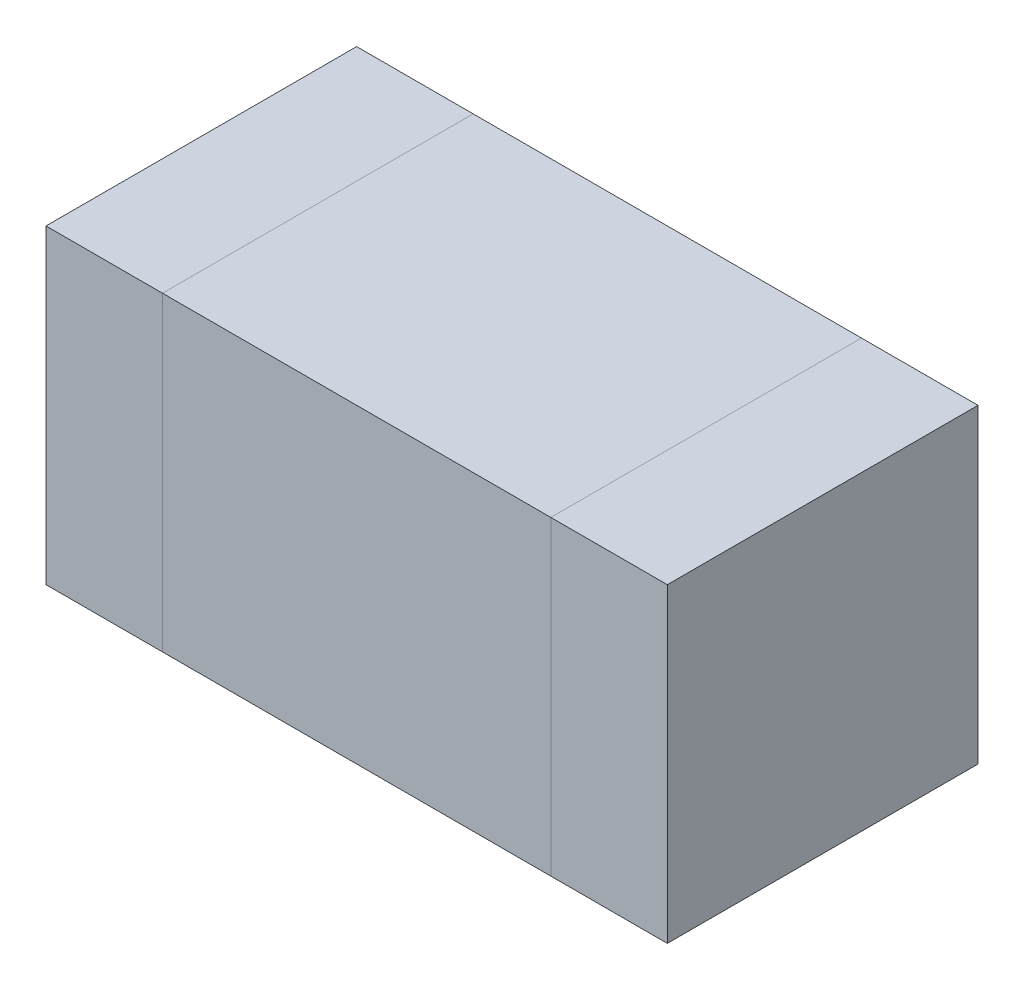
ISO-10303-21;
HEADER;
FILE_DESCRIPTION(('STEP AP214'),'2;1');
FILE_NAME('part.step','',(''),(''),'','','');
FILE_SCHEMA(('AUTOMOTIVE_DESIGN { 1 0 10303 214 1 1 1 1 }'));
ENDSEC;
DATA;
#1=APPLICATION_CONTEXT('core data for automotive mechanical design processes');
#2=APPLICATION_PROTOCOL_DEFINITION('international standard','automotive_design',2000,#1);
#3=PRODUCT_CONTEXT('',#1,'mechanical');
#4=PRODUCT('Part','Part','',(#3));
#5=PRODUCT_RELATED_PRODUCT_CATEGORY('part','',(#4));
#6=PRODUCT_DEFINITION_FORMATION('','',#4);
#7=PRODUCT_DEFINITION_CONTEXT('part definition',#1,'design');
#8=PRODUCT_DEFINITION('design','',#6,#7);
#9=PRODUCT_DEFINITION_SHAPE('','',#8);
#10=(LENGTH_UNIT() NAMED_UNIT(*) SI_UNIT(.MILLI.,.METRE.));
#11=(NAMED_UNIT(*) PLANE_ANGLE_UNIT() SI_UNIT($,.RADIAN.));
#12=(NAMED_UNIT(*) SI_UNIT($,.STERADIAN.) SOLID_ANGLE_UNIT());
#13=UNCERTAINTY_MEASURE_WITH_UNIT(LENGTH_MEASURE(1.E-05),#10,'distance_accuracy_value','');
#14=(GEOMETRIC_REPRESENTATION_CONTEXT(3) GLOBAL_UNCERTAINTY_ASSIGNED_CONTEXT((#13)) GLOBAL_UNIT_ASSIGNED_CONTEXT((#10,
#11,#12)) REPRESENTATION_CONTEXT('',''));
#15=CARTESIAN_POINT('',(0.,0.,0.));
#16=DIRECTION('',(0.,0.,1.));
#17=DIRECTION('',(1.,0.,0.));
#18=AXIS2_PLACEMENT_3D('',#15,#16,#17);
#19=CARTESIAN_POINT('',(-0.46187968,0.38093984,0.80999918));
#20=DIRECTION('',(1.,0.,0.));
#21=DIRECTION('',(0.,0.,-1.));
#22=AXIS2_PLACEMENT_3D('',#19,#20,#21);
#23=PLANE('',#22);
#24=DIRECTION('',(0.,-1.,0.));
#25=VECTOR('',#24,1.);
#26=CARTESIAN_POINT('',(-0.46187968,0.38093984,0.00999917999999994));
#27=LINE('',#26,#25);
#28=CARTESIAN_POINT('',(-0.46187968,0.38093984,0.00999917999999994));
#29=VERTEX_POINT('',#28);
#30=CARTESIAN_POINT('',(-0.46187968,-0.41906016,0.00999917999999994));
#31=VERTEX_POINT('',#30);
#32=EDGE_CURVE('P0_E11',#29,#31,#27,.T.);
#33=ORIENTED_EDGE('',*,*,#32,.T.);
#34=DIRECTION('',(0.,0.,-1.));
#35=VECTOR('',#34,1.);
#36=CARTESIAN_POINT('',(-0.46187968,-0.41906016,0.80999918));
#37=LINE('',#36,#35);
#38=CARTESIAN_POINT('',(-0.46187968,-0.41906016,0.80999918));
#39=VERTEX_POINT('',#38);
#40=EDGE_CURVE('P0_E24',#39,#31,#37,.T.);
#41=ORIENTED_EDGE('',*,*,#40,.F.);
#42=DIRECTION('',(0.,-1.,0.));
#43=VECTOR('',#42,1.);
#44=CARTESIAN_POINT('',(-0.46187968,0.38093984,0.80999918));
#45=LINE('',#44,#43);
#46=CARTESIAN_POINT('',(-0.46187968,0.38093984,0.80999918));
#47=VERTEX_POINT('',#46);
#48=EDGE_CURVE('P0_E88',#47,#39,#45,.T.);
#49=ORIENTED_EDGE('',*,*,#48,.F.);
#50=DIRECTION('',(0.,0.,-1.));
#51=VECTOR('',#50,1.);
#52=CARTESIAN_POINT('',(-0.46187968,0.38093984,0.80999918));
#53=LINE('',#52,#51);
#54=EDGE_CURVE('P0_E76',#47,#29,#53,.T.);
#55=ORIENTED_EDGE('',*,*,#54,.T.);
#56=EDGE_LOOP('',(#33,#41,#49,#55));
#57=FACE_BOUND('',#56,.T.);
#58=ADVANCED_FACE('P0_F17',(#57),#23,.F.);
#59=CARTESIAN_POINT('',(-0.46187968,-0.41906016,0.80999918));
#60=DIRECTION('',(0.,1.,0.));
#61=DIRECTION('',(-1.,0.,0.));
#62=AXIS2_PLACEMENT_3D('',#59,#60,#61);
#63=PLANE('',#62);
#64=DIRECTION('',(1.,0.,0.));
#65=VECTOR('',#64,1.);
#66=CARTESIAN_POINT('',(-0.46187968,-0.41906016,0.00999917999999994));
#67=LINE('',#66,#65);
#68=CARTESIAN_POINT('',(0.53812032,-0.41906016,0.00999917999999994));
#69=VERTEX_POINT('',#68);
#70=EDGE_CURVE('P0_E84',#31,#69,#67,.T.);
#71=ORIENTED_EDGE('',*,*,#70,.T.);
#72=DIRECTION('',(0.,0.,-1.));
#73=VECTOR('',#72,1.);
#74=CARTESIAN_POINT('',(0.53812032,-0.41906016,0.80999918));
#75=LINE('',#74,#73);
#76=CARTESIAN_POINT('',(0.53812032,-0.41906016,0.80999918));
#77=VERTEX_POINT('',#76);
#78=EDGE_CURVE('P0_E82',#77,#69,#75,.T.);
#79=ORIENTED_EDGE('',*,*,#78,.F.);
#80=DIRECTION('',(1.,0.,0.));
#81=VECTOR('',#80,1.);
#82=CARTESIAN_POINT('',(-0.46187968,-0.41906016,0.80999918));
#83=LINE('',#82,#81);
#84=EDGE_CURVE('P0_E70',#39,#77,#83,.T.);
#85=ORIENTED_EDGE('',*,*,#84,.F.);
#86=ORIENTED_EDGE('',*,*,#40,.T.);
#87=EDGE_LOOP('',(#71,#79,#85,#86));
#88=FACE_BOUND('',#87,.T.);
#89=ADVANCED_FACE('P0_F90',(#88),#63,.F.);
#90=CARTESIAN_POINT('',(0.53812032,-0.41906016,0.80999918));
#91=DIRECTION('',(-1.,0.,0.));
#92=DIRECTION('',(0.,-1.,0.));
#93=AXIS2_PLACEMENT_3D('',#90,#91,#92);
#94=PLANE('',#93);
#95=DIRECTION('',(0.,1.,0.));
#96=VECTOR('',#95,1.);
#97=CARTESIAN_POINT('',(0.53812032,-0.41906016,0.00999917999999994));
#98=LINE('',#97,#96);
#99=CARTESIAN_POINT('',(0.53812032,0.38093984,0.00999917999999994));
#100=VERTEX_POINT('',#99);
#101=EDGE_CURVE('P0_E59',#69,#100,#98,.T.);
#102=ORIENTED_EDGE('',*,*,#101,.T.);
#103=DIRECTION('',(0.,0.,-1.));
#104=VECTOR('',#103,1.);
#105=CARTESIAN_POINT('',(0.53812032,0.38093984,0.80999918));
#106=LINE('',#105,#104);
#107=CARTESIAN_POINT('',(0.53812032,0.38093984,0.80999918));
#108=VERTEX_POINT('',#107);
#109=EDGE_CURVE('P0_E54',#108,#100,#106,.T.);
#110=ORIENTED_EDGE('',*,*,#109,.F.);
#111=DIRECTION('',(0.,1.,0.));
#112=VECTOR('',#111,1.);
#113=CARTESIAN_POINT('',(0.53812032,-0.41906016,0.80999918));
#114=LINE('',#113,#112);
#115=EDGE_CURVE('P0_E58',#77,#108,#114,.T.);
#116=ORIENTED_EDGE('',*,*,#115,.F.);
#117=ORIENTED_EDGE('',*,*,#78,.T.);
#118=EDGE_LOOP('',(#102,#110,#116,#117));
#119=FACE_BOUND('',#118,.T.);
#120=ADVANCED_FACE('P0_F56',(#119),#94,.F.);
#121=CARTESIAN_POINT('',(0.53812032,0.38093984,0.80999918));
#122=DIRECTION('',(0.,-1.,0.));
#123=DIRECTION('',(1.,0.,0.));
#124=AXIS2_PLACEMENT_3D('',#121,#122,#123);
#125=PLANE('',#124);
#126=DIRECTION('',(-1.,0.,0.));
#127=VECTOR('',#126,1.);
#128=CARTESIAN_POINT('',(0.53812032,0.38093984,0.00999917999999994));
#129=LINE('',#128,#127);
#130=EDGE_CURVE('P0_E72',#100,#29,#129,.T.);
#131=ORIENTED_EDGE('',*,*,#130,.T.);
#132=ORIENTED_EDGE('',*,*,#54,.F.);
#133=DIRECTION('',(-1.,0.,0.));
#134=VECTOR('',#133,1.);
#135=CARTESIAN_POINT('',(0.53812032,0.38093984,0.80999918));
#136=LINE('',#135,#134);
#137=EDGE_CURVE('P0_E68',#108,#47,#136,.T.);
#138=ORIENTED_EDGE('',*,*,#137,.F.);
#139=ORIENTED_EDGE('',*,*,#109,.T.);
#140=EDGE_LOOP('',(#131,#132,#138,#139));
#141=FACE_BOUND('',#140,.T.);
#142=ADVANCED_FACE('P0_F75',(#141),#125,.F.);
#143=CARTESIAN_POINT('',(0.03812032,-0.01906016,0.00999917999999994));
#144=DIRECTION('',(0.,0.,1.));
#145=DIRECTION('',(0.,1.,0.));
#146=AXIS2_PLACEMENT_3D('',#143,#144,#145);
#147=PLANE('',#146);
#148=ORIENTED_EDGE('',*,*,#32,.F.);
#149=ORIENTED_EDGE('',*,*,#130,.F.);
#150=ORIENTED_EDGE('',*,*,#101,.F.);
#151=ORIENTED_EDGE('',*,*,#70,.F.);
#152=EDGE_LOOP('',(#148,#149,#150,#151));
#153=FACE_BOUND('',#152,.T.);
#154=ADVANCED_FACE('P0_F91',(#153),#147,.F.);
#155=CARTESIAN_POINT('',(0.03812032,-0.01906016,0.80999918));
#156=DIRECTION('',(0.,0.,1.));
#157=DIRECTION('',(0.,1.,0.));
#158=AXIS2_PLACEMENT_3D('',#155,#156,#157);
#159=PLANE('',#158);
#160=ORIENTED_EDGE('',*,*,#48,.T.);
#161=ORIENTED_EDGE('',*,*,#84,.T.);
#162=ORIENTED_EDGE('',*,*,#115,.T.);
#163=ORIENTED_EDGE('',*,*,#137,.T.);
#164=EDGE_LOOP('',(#160,#161,#162,#163));
#165=FACE_BOUND('',#164,.T.);
#166=ADVANCED_FACE('P0_F67',(#165),#159,.T.);
#167=CLOSED_SHELL('',(#58,#89,#120,#142,#154,#166));
#168=MANIFOLD_SOLID_BREP('P0_B1',#167);
#169=CARTESIAN_POINT('',(0.83812032,-0.419060159999988,0.809999180000001));
#170=DIRECTION('',(0.,1.,0.));
#171=DIRECTION('',(0.,0.,-1.));
#172=AXIS2_PLACEMENT_3D('',#169,#170,#171);
#173=PLANE('',#172);
#174=DIRECTION('',(0.,0.,-1.));
#175=VECTOR('',#174,1.);
#176=CARTESIAN_POINT('',(0.53812032,-0.419060159999988,0.809999180000001));
#177=LINE('',#176,#175);
#178=CARTESIAN_POINT('',(0.53812032,-0.419060159999988,0.809999180000001));
#179=VERTEX_POINT('',#178);
#180=CARTESIAN_POINT('',(0.53812032,-0.419060159999988,0.00999918000000133));
#181=VERTEX_POINT('',#180);
#182=EDGE_CURVE('P1_E11',#179,#181,#177,.T.);
#183=ORIENTED_EDGE('',*,*,#182,.T.);
#184=DIRECTION('',(-1.,0.,0.));
#185=VECTOR('',#184,1.);
#186=CARTESIAN_POINT('',(0.83812032,-0.419060159999988,0.00999918000000133));
#187=LINE('',#186,#185);
#188=CARTESIAN_POINT('',(0.83812032,-0.419060159999988,0.00999918000000133));
#189=VERTEX_POINT('',#188);
#190=EDGE_CURVE('P1_E24',#189,#181,#187,.T.);
#191=ORIENTED_EDGE('',*,*,#190,.F.);
#192=DIRECTION('',(0.,0.,-1.));
#193=VECTOR('',#192,1.);
#194=CARTESIAN_POINT('',(0.83812032,-0.419060159999988,0.809999180000001));
#195=LINE('',#194,#193);
#196=CARTESIAN_POINT('',(0.83812032,-0.419060159999988,0.809999180000001));
#197=VERTEX_POINT('',#196);
#198=EDGE_CURVE('P1_E88',#197,#189,#195,.T.);
#199=ORIENTED_EDGE('',*,*,#198,.F.);
#200=DIRECTION('',(-1.,0.,0.));
#201=VECTOR('',#200,1.);
#202=CARTESIAN_POINT('',(0.83812032,-0.419060159999988,0.809999180000001));
#203=LINE('',#202,#201);
#204=EDGE_CURVE('P1_E72',#197,#179,#203,.T.);
#205=ORIENTED_EDGE('',*,*,#204,.T.);
#206=EDGE_LOOP('',(#183,#191,#199,#205));
#207=FACE_BOUND('',#206,.T.);
#208=ADVANCED_FACE('P1_F17',(#207),#173,.F.);
#209=CARTESIAN_POINT('',(0.83812032,-0.419060159999988,0.00999918000000133));
#210=DIRECTION('',(0.,0.,1.));
#211=DIRECTION('',(0.,1.,0.));
#212=AXIS2_PLACEMENT_3D('',#209,#210,#211);
#213=PLANE('',#212);
#214=DIRECTION('',(0.,1.,0.));
#215=VECTOR('',#214,1.);
#216=CARTESIAN_POINT('',(0.53812032,-0.419060159999988,0.00999918000000133));
#217=LINE('',#216,#215);
#218=CARTESIAN_POINT('',(0.53812032,0.380939840000012,0.00999918000000133));
#219=VERTEX_POINT('',#218);
#220=EDGE_CURVE('P1_E84',#181,#219,#217,.T.);
#221=ORIENTED_EDGE('',*,*,#220,.T.);
#222=DIRECTION('',(-1.,0.,0.));
#223=VECTOR('',#222,1.);
#224=CARTESIAN_POINT('',(0.83812032,0.380939840000012,0.00999918000000133));
#225=LINE('',#224,#223);
#226=CARTESIAN_POINT('',(0.83812032,0.380939840000012,0.00999918000000133));
#227=VERTEX_POINT('',#226);
#228=EDGE_CURVE('P1_E82',#227,#219,#225,.T.);
#229=ORIENTED_EDGE('',*,*,#228,.F.);
#230=DIRECTION('',(0.,1.,0.));
#231=VECTOR('',#230,1.);
#232=CARTESIAN_POINT('',(0.83812032,-0.419060159999988,0.00999918000000133));
#233=LINE('',#232,#231);
#234=EDGE_CURVE('P1_E61',#189,#227,#233,.T.);
#235=ORIENTED_EDGE('',*,*,#234,.F.);
#236=ORIENTED_EDGE('',*,*,#190,.T.);
#237=EDGE_LOOP('',(#221,#229,#235,#236));
#238=FACE_BOUND('',#237,.T.);
#239=ADVANCED_FACE('P1_F90',(#238),#213,.F.);
#240=CARTESIAN_POINT('',(0.83812032,0.380939840000012,0.00999918000000133));
#241=DIRECTION('',(0.,-1.,0.));
#242=DIRECTION('',(0.,0.,1.));
#243=AXIS2_PLACEMENT_3D('',#240,#241,#242);
#244=PLANE('',#243);
#245=DIRECTION('',(0.,0.,1.));
#246=VECTOR('',#245,1.);
#247=CARTESIAN_POINT('',(0.53812032,0.380939840000012,0.00999918000000133));
#248=LINE('',#247,#246);
#249=CARTESIAN_POINT('',(0.53812032,0.380939840000012,0.809999180000001));
#250=VERTEX_POINT('',#249);
#251=EDGE_CURVE('P1_E76',#219,#250,#248,.T.);
#252=ORIENTED_EDGE('',*,*,#251,.T.);
#253=DIRECTION('',(-1.,0.,0.));
#254=VECTOR('',#253,1.);
#255=CARTESIAN_POINT('',(0.83812032,0.380939840000012,0.809999180000001));
#256=LINE('',#255,#254);
#257=CARTESIAN_POINT('',(0.83812032,0.380939840000012,0.809999180000001));
#258=VERTEX_POINT('',#257);
#259=EDGE_CURVE('P1_E66',#258,#250,#256,.T.);
#260=ORIENTED_EDGE('',*,*,#259,.F.);
#261=DIRECTION('',(0.,0.,1.));
#262=VECTOR('',#261,1.);
#263=CARTESIAN_POINT('',(0.83812032,0.380939840000012,0.00999918000000133));
#264=LINE('',#263,#262);
#265=EDGE_CURVE('P1_E55',#227,#258,#264,.T.);
#266=ORIENTED_EDGE('',*,*,#265,.F.);
#267=ORIENTED_EDGE('',*,*,#228,.T.);
#268=EDGE_LOOP('',(#252,#260,#266,#267));
#269=FACE_BOUND('',#268,.T.);
#270=ADVANCED_FACE('P1_F75',(#269),#244,.F.);
#271=CARTESIAN_POINT('',(0.83812032,0.380939840000012,0.809999180000001));
#272=DIRECTION('',(0.,0.,-1.));
#273=DIRECTION('',(0.,-1.,0.));
#274=AXIS2_PLACEMENT_3D('',#271,#272,#273);
#275=PLANE('',#274);
#276=DIRECTION('',(0.,-1.,0.));
#277=VECTOR('',#276,1.);
#278=CARTESIAN_POINT('',(0.53812032,0.380939840000012,0.809999180000001));
#279=LINE('',#278,#277);
#280=EDGE_CURVE('P1_E67',#250,#179,#279,.T.);
#281=ORIENTED_EDGE('',*,*,#280,.T.);
#282=ORIENTED_EDGE('',*,*,#204,.F.);
#283=DIRECTION('',(0.,-1.,0.));
#284=VECTOR('',#283,1.);
#285=CARTESIAN_POINT('',(0.83812032,0.380939840000012,0.809999180000001));
#286=LINE('',#285,#284);
#287=EDGE_CURVE('P1_E59',#258,#197,#286,.T.);
#288=ORIENTED_EDGE('',*,*,#287,.F.);
#289=ORIENTED_EDGE('',*,*,#259,.T.);
#290=EDGE_LOOP('',(#281,#282,#288,#289));
#291=FACE_BOUND('',#290,.T.);
#292=ADVANCED_FACE('P1_F71',(#291),#275,.F.);
#293=CARTESIAN_POINT('',(0.53812032,-0.0190601599999881,0.409999180000001));
#294=DIRECTION('',(1.,0.,0.));
#295=DIRECTION('',(0.,0.,-1.));
#296=AXIS2_PLACEMENT_3D('',#293,#294,#295);
#297=PLANE('',#296);
#298=ORIENTED_EDGE('',*,*,#182,.F.);
#299=ORIENTED_EDGE('',*,*,#280,.F.);
#300=ORIENTED_EDGE('',*,*,#251,.F.);
#301=ORIENTED_EDGE('',*,*,#220,.F.);
#302=EDGE_LOOP('',(#298,#299,#300,#301));
#303=FACE_BOUND('',#302,.T.);
#304=ADVANCED_FACE('P1_F91',(#303),#297,.F.);
#305=CARTESIAN_POINT('',(0.83812032,-0.0190601599999881,0.409999180000001));
#306=DIRECTION('',(1.,0.,0.));
#307=DIRECTION('',(0.,0.,-1.));
#308=AXIS2_PLACEMENT_3D('',#305,#306,#307);
#309=PLANE('',#308);
#310=ORIENTED_EDGE('',*,*,#198,.T.);
#311=ORIENTED_EDGE('',*,*,#234,.T.);
#312=ORIENTED_EDGE('',*,*,#265,.T.);
#313=ORIENTED_EDGE('',*,*,#287,.T.);
#314=EDGE_LOOP('',(#310,#311,#312,#313));
#315=FACE_BOUND('',#314,.T.);
#316=ADVANCED_FACE('P1_F58',(#315),#309,.T.);
#317=CLOSED_SHELL('',(#208,#239,#270,#292,#304,#316));
#318=MANIFOLD_SOLID_BREP('P1_B1',#317);
#319=CARTESIAN_POINT('',(-0.76187968,-0.419060160000003,0.809999179999996));
#320=DIRECTION('',(0.,0.,-1.));
#321=DIRECTION('',(0.,1.,0.));
#322=AXIS2_PLACEMENT_3D('',#319,#320,#321);
#323=PLANE('',#322);
#324=DIRECTION('',(0.,1.,0.));
#325=VECTOR('',#324,1.);
#326=CARTESIAN_POINT('',(-0.46187968,-0.419060160000003,0.809999179999996));
#327=LINE('',#326,#325);
#328=CARTESIAN_POINT('',(-0.46187968,-0.419060160000003,0.809999179999996));
#329=VERTEX_POINT('',#328);
#330=CARTESIAN_POINT('',(-0.46187968,0.380939839999997,0.809999179999996));
#331=VERTEX_POINT('',#330);
#332=EDGE_CURVE('P2_E10',#329,#331,#327,.T.);
#333=ORIENTED_EDGE('',*,*,#332,.T.);
#334=DIRECTION('',(1.,0.,0.));
#335=VECTOR('',#334,1.);
#336=CARTESIAN_POINT('',(-0.76187968,0.380939839999997,0.809999179999996));
#337=LINE('',#336,#335);
#338=CARTESIAN_POINT('',(-0.76187968,0.380939839999997,0.809999179999996));
#339=VERTEX_POINT('',#338);
#340=EDGE_CURVE('P2_E23',#339,#331,#337,.T.);
#341=ORIENTED_EDGE('',*,*,#340,.F.);
#342=DIRECTION('',(0.,1.,0.));
#343=VECTOR('',#342,1.);
#344=CARTESIAN_POINT('',(-0.76187968,-0.419060160000003,0.809999179999996));
#345=LINE('',#344,#343);
#346=CARTESIAN_POINT('',(-0.76187968,-0.419060160000003,0.809999179999996));
#347=VERTEX_POINT('',#346);
#348=EDGE_CURVE('P2_E87',#347,#339,#345,.T.);
#349=ORIENTED_EDGE('',*,*,#348,.F.);
#350=DIRECTION('',(1.,0.,0.));
#351=VECTOR('',#350,1.);
#352=CARTESIAN_POINT('',(-0.76187968,-0.419060160000003,0.809999179999996));
#353=LINE('',#352,#351);
#354=EDGE_CURVE('P2_E75',#347,#329,#353,.T.);
#355=ORIENTED_EDGE('',*,*,#354,.T.);
#356=EDGE_LOOP('',(#333,#341,#349,#355));
#357=FACE_BOUND('',#356,.T.);
#358=ADVANCED_FACE('P2_F16',(#357),#323,.F.);
#359=CARTESIAN_POINT('',(-0.76187968,0.380939839999997,0.809999179999996));
#360=DIRECTION('',(0.,-1.,0.));
#361=DIRECTION('',(0.,0.,-1.));
#362=AXIS2_PLACEMENT_3D('',#359,#360,#361);
#363=PLANE('',#362);
#364=DIRECTION('',(0.,0.,-1.));
#365=VECTOR('',#364,1.);
#366=CARTESIAN_POINT('',(-0.46187968,0.380939839999997,0.809999179999996));
#367=LINE('',#366,#365);
#368=CARTESIAN_POINT('',(-0.46187968,0.380939839999997,0.00999917999999572));
#369=VERTEX_POINT('',#368);
#370=EDGE_CURVE('P2_E84',#331,#369,#367,.T.);
#371=ORIENTED_EDGE('',*,*,#370,.T.);
#372=DIRECTION('',(1.,0.,0.));
#373=VECTOR('',#372,1.);
#374=CARTESIAN_POINT('',(-0.76187968,0.380939839999997,0.00999917999999572));
#375=LINE('',#374,#373);
#376=CARTESIAN_POINT('',(-0.76187968,0.380939839999997,0.00999917999999572));
#377=VERTEX_POINT('',#376);
#378=EDGE_CURVE('P2_E82',#377,#369,#375,.T.);
#379=ORIENTED_EDGE('',*,*,#378,.F.);
#380=DIRECTION('',(0.,0.,-1.));
#381=VECTOR('',#380,1.);
#382=CARTESIAN_POINT('',(-0.76187968,0.380939839999997,0.809999179999996));
#383=LINE('',#382,#381);
#384=EDGE_CURVE('P2_E70',#339,#377,#383,.T.);
#385=ORIENTED_EDGE('',*,*,#384,.F.);
#386=ORIENTED_EDGE('',*,*,#340,.T.);
#387=EDGE_LOOP('',(#371,#379,#385,#386));
#388=FACE_BOUND('',#387,.T.);
#389=ADVANCED_FACE('P2_F89',(#388),#363,.F.);
#390=CARTESIAN_POINT('',(-0.76187968,0.380939839999997,0.00999917999999572));
#391=DIRECTION('',(0.,0.,1.));
#392=DIRECTION('',(0.,-1.,0.));
#393=AXIS2_PLACEMENT_3D('',#390,#391,#392);
#394=PLANE('',#393);
#395=DIRECTION('',(0.,-1.,0.));
#396=VECTOR('',#395,1.);
#397=CARTESIAN_POINT('',(-0.46187968,0.380939839999997,0.00999917999999572));
#398=LINE('',#397,#396);
#399=CARTESIAN_POINT('',(-0.46187968,-0.419060160000003,0.00999917999999583));
#400=VERTEX_POINT('',#399);
#401=EDGE_CURVE('P2_E60',#369,#400,#398,.T.);
#402=ORIENTED_EDGE('',*,*,#401,.T.);
#403=DIRECTION('',(1.,0.,0.));
#404=VECTOR('',#403,1.);
#405=CARTESIAN_POINT('',(-0.76187968,-0.419060160000003,0.00999917999999583));
#406=LINE('',#405,#404);
#407=CARTESIAN_POINT('',(-0.76187968,-0.419060160000003,0.00999917999999583));
#408=VERTEX_POINT('',#407);
#409=EDGE_CURVE('P2_E54',#408,#400,#406,.T.);
#410=ORIENTED_EDGE('',*,*,#409,.F.);
#411=DIRECTION('',(0.,-1.,0.));
#412=VECTOR('',#411,1.);
#413=CARTESIAN_POINT('',(-0.76187968,0.380939839999997,0.00999917999999572));
#414=LINE('',#413,#412);
#415=EDGE_CURVE('P2_E58',#377,#408,#414,.T.);
#416=ORIENTED_EDGE('',*,*,#415,.F.);
#417=ORIENTED_EDGE('',*,*,#378,.T.);
#418=EDGE_LOOP('',(#402,#410,#416,#417));
#419=FACE_BOUND('',#418,.T.);
#420=ADVANCED_FACE('P2_F56',(#419),#394,.F.);
#421=CARTESIAN_POINT('',(-0.76187968,-0.419060160000003,0.00999917999999583));
#422=DIRECTION('',(0.,1.,0.));
#423=DIRECTION('',(0.,0.,1.));
#424=AXIS2_PLACEMENT_3D('',#421,#422,#423);
#425=PLANE('',#424);
#426=DIRECTION('',(0.,0.,1.));
#427=VECTOR('',#426,1.);
#428=CARTESIAN_POINT('',(-0.46187968,-0.419060160000003,0.00999917999999583));
#429=LINE('',#428,#427);
#430=EDGE_CURVE('P2_E72',#400,#329,#429,.T.);
#431=ORIENTED_EDGE('',*,*,#430,.T.);
#432=ORIENTED_EDGE('',*,*,#354,.F.);
#433=DIRECTION('',(0.,0.,1.));
#434=VECTOR('',#433,1.);
#435=CARTESIAN_POINT('',(-0.76187968,-0.419060160000003,0.00999917999999583));
#436=LINE('',#435,#434);
#437=EDGE_CURVE('P2_E69',#408,#347,#436,.T.);
#438=ORIENTED_EDGE('',*,*,#437,.F.);
#439=ORIENTED_EDGE('',*,*,#409,.T.);
#440=EDGE_LOOP('',(#431,#432,#438,#439));
#441=FACE_BOUND('',#440,.T.);
#442=ADVANCED_FACE('P2_F74',(#441),#425,.F.);
#443=CARTESIAN_POINT('',(-0.46187968,-0.0190601600000034,0.409999179999996));
#444=DIRECTION('',(-1.,0.,0.));
#445=DIRECTION('',(0.,1.,0.));
#446=AXIS2_PLACEMENT_3D('',#443,#444,#445);
#447=PLANE('',#446);
#448=ORIENTED_EDGE('',*,*,#332,.F.);
#449=ORIENTED_EDGE('',*,*,#430,.F.);
#450=ORIENTED_EDGE('',*,*,#401,.F.);
#451=ORIENTED_EDGE('',*,*,#370,.F.);
#452=EDGE_LOOP('',(#448,#449,#450,#451));
#453=FACE_BOUND('',#452,.T.);
#454=ADVANCED_FACE('P2_F90',(#453),#447,.F.);
#455=CARTESIAN_POINT('',(-0.76187968,-0.0190601600000033,0.409999179999996));
#456=DIRECTION('',(-1.,0.,0.));
#457=DIRECTION('',(0.,1.,0.));
#458=AXIS2_PLACEMENT_3D('',#455,#456,#457);
#459=PLANE('',#458);
#460=ORIENTED_EDGE('',*,*,#348,.T.);
#461=ORIENTED_EDGE('',*,*,#384,.T.);
#462=ORIENTED_EDGE('',*,*,#415,.T.);
#463=ORIENTED_EDGE('',*,*,#437,.T.);
#464=EDGE_LOOP('',(#460,#461,#462,#463));
#465=FACE_BOUND('',#464,.T.);
#466=ADVANCED_FACE('P2_F68',(#465),#459,.T.);
#467=CLOSED_SHELL('',(#358,#389,#420,#442,#454,#466));
#468=MANIFOLD_SOLID_BREP('P2_B1',#467);
#469=ADVANCED_BREP_SHAPE_REPRESENTATION('',(#18,#168,#318,#468),#14);
#470=SHAPE_DEFINITION_REPRESENTATION(#9,#469);
ENDSEC;
END-ISO-10303-21;
